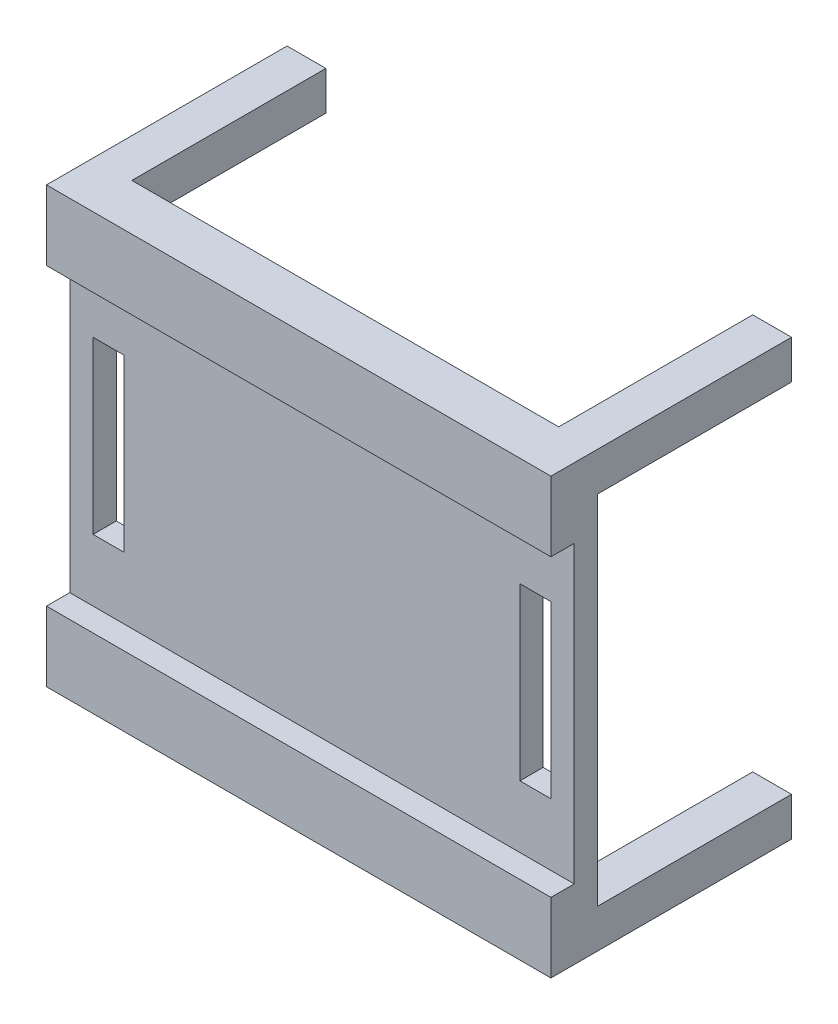
ISO-10303-21;
HEADER;
FILE_DESCRIPTION(('STEP AP214'),'2;1');
FILE_NAME('part.step','',(''),(''),'','','');
FILE_SCHEMA(('AUTOMOTIVE_DESIGN { 1 0 10303 214 1 1 1 1 }'));
ENDSEC;
DATA;
#1=APPLICATION_CONTEXT('core data for automotive mechanical design processes');
#2=APPLICATION_PROTOCOL_DEFINITION('international standard','automotive_design',2000,#1);
#3=PRODUCT_CONTEXT('',#1,'mechanical');
#4=PRODUCT('Part','Part','',(#3));
#5=PRODUCT_RELATED_PRODUCT_CATEGORY('part','',(#4));
#6=PRODUCT_DEFINITION_FORMATION('','',#4);
#7=PRODUCT_DEFINITION_CONTEXT('part definition',#1,'design');
#8=PRODUCT_DEFINITION('design','',#6,#7);
#9=PRODUCT_DEFINITION_SHAPE('','',#8);
#10=(LENGTH_UNIT() NAMED_UNIT(*) SI_UNIT(.MILLI.,.METRE.));
#11=(NAMED_UNIT(*) PLANE_ANGLE_UNIT() SI_UNIT($,.RADIAN.));
#12=(NAMED_UNIT(*) SI_UNIT($,.STERADIAN.) SOLID_ANGLE_UNIT());
#13=UNCERTAINTY_MEASURE_WITH_UNIT(LENGTH_MEASURE(1.E-05),#10,'distance_accuracy_value','');
#14=(GEOMETRIC_REPRESENTATION_CONTEXT(3) GLOBAL_UNCERTAINTY_ASSIGNED_CONTEXT((#13)) GLOBAL_UNIT_ASSIGNED_CONTEXT((#10,
#11,#12)) REPRESENTATION_CONTEXT('',''));
#15=CARTESIAN_POINT('',(0.,0.,0.));
#16=DIRECTION('',(0.,0.,1.));
#17=DIRECTION('',(1.,0.,0.));
#18=AXIS2_PLACEMENT_3D('',#15,#16,#17);
#19=CARTESIAN_POINT('',(0.,0.,0.));
#20=DIRECTION('',(0.,0.,1.));
#21=DIRECTION('',(1.,0.,0.));
#22=AXIS2_PLACEMENT_3D('',#19,#20,#21);
#23=PLANE('',#22);
#24=DIRECTION('',(-1.,0.,0.));
#25=VECTOR('',#24,1.);
#26=CARTESIAN_POINT('',(-25.5,-11.,0.));
#27=LINE('',#26,#25);
#28=CARTESIAN_POINT('',(-25.5,-11.,0.));
#29=VERTEX_POINT('',#28);
#30=CARTESIAN_POINT('',(-29.5,-11.,0.));
#31=VERTEX_POINT('',#30);
#32=EDGE_CURVE('E317',#29,#31,#27,.T.);
#33=ORIENTED_EDGE('',*,*,#32,.F.);
#34=DIRECTION('',(0.,-1.,0.));
#35=VECTOR('',#34,1.);
#36=CARTESIAN_POINT('',(-25.5,-11.,0.));
#37=LINE('',#36,#35);
#38=CARTESIAN_POINT('',(-25.5,11.,0.));
#39=VERTEX_POINT('',#38);
#40=EDGE_CURVE('E293',#39,#29,#37,.T.);
#41=ORIENTED_EDGE('',*,*,#40,.F.);
#42=DIRECTION('',(1.,0.,0.));
#43=VECTOR('',#42,1.);
#44=CARTESIAN_POINT('',(-25.5,11.,0.));
#45=LINE('',#44,#43);
#46=CARTESIAN_POINT('',(-29.5,11.,0.));
#47=VERTEX_POINT('',#46);
#48=EDGE_CURVE('E323',#47,#39,#45,.T.);
#49=ORIENTED_EDGE('',*,*,#48,.F.);
#50=DIRECTION('',(0.,1.,0.));
#51=VECTOR('',#50,1.);
#52=CARTESIAN_POINT('',(-29.5,-11.,0.));
#53=LINE('',#52,#51);
#54=EDGE_CURVE('E320',#31,#47,#53,.T.);
#55=ORIENTED_EDGE('',*,*,#54,.F.);
#56=EDGE_LOOP('',(#33,#41,#49,#55));
#57=FACE_BOUND('',#56,.T.);
#58=DIRECTION('',(-1.,0.,0.));
#59=VECTOR('',#58,1.);
#60=CARTESIAN_POINT('',(25.5,-11.,0.));
#61=LINE('',#60,#59);
#62=CARTESIAN_POINT('',(29.5,-11.,0.));
#63=VERTEX_POINT('',#62);
#64=CARTESIAN_POINT('',(25.5,-11.,0.));
#65=VERTEX_POINT('',#64);
#66=EDGE_CURVE('E296',#63,#65,#61,.T.);
#67=ORIENTED_EDGE('',*,*,#66,.F.);
#68=DIRECTION('',(0.,-1.,0.));
#69=VECTOR('',#68,1.);
#70=CARTESIAN_POINT('',(29.5,-11.,0.));
#71=LINE('',#70,#69);
#72=CARTESIAN_POINT('',(29.5,11.,0.));
#73=VERTEX_POINT('',#72);
#74=EDGE_CURVE('E294',#73,#63,#71,.T.);
#75=ORIENTED_EDGE('',*,*,#74,.F.);
#76=DIRECTION('',(1.,0.,0.));
#77=VECTOR('',#76,1.);
#78=CARTESIAN_POINT('',(25.5,11.,0.));
#79=LINE('',#78,#77);
#80=CARTESIAN_POINT('',(25.5,11.,0.));
#81=VERTEX_POINT('',#80);
#82=EDGE_CURVE('E303',#81,#73,#79,.T.);
#83=ORIENTED_EDGE('',*,*,#82,.F.);
#84=DIRECTION('',(0.,1.,0.));
#85=VECTOR('',#84,1.);
#86=CARTESIAN_POINT('',(25.5,-11.,0.));
#87=LINE('',#86,#85);
#88=EDGE_CURVE('E300',#65,#81,#87,.T.);
#89=ORIENTED_EDGE('',*,*,#88,.F.);
#90=EDGE_LOOP('',(#67,#75,#83,#89));
#91=FACE_BOUND('',#90,.T.);
#92=DIRECTION('',(1.,0.,0.));
#93=VECTOR('',#92,1.);
#94=CARTESIAN_POINT('',(-32.5,-23.,0.));
#95=LINE('',#94,#93);
#96=CARTESIAN_POINT('',(-32.5,-23.,0.));
#97=VERTEX_POINT('',#96);
#98=CARTESIAN_POINT('',(-27.5,-23.,0.));
#99=VERTEX_POINT('',#98);
#100=EDGE_CURVE('E54',#97,#99,#95,.T.);
#101=ORIENTED_EDGE('',*,*,#100,.F.);
#102=DIRECTION('',(0.,1.,0.));
#103=VECTOR('',#102,1.);
#104=CARTESIAN_POINT('',(-32.5,0.,0.));
#105=LINE('',#104,#103);
#106=CARTESIAN_POINT('',(-32.5,23.,0.));
#107=VERTEX_POINT('',#106);
#108=EDGE_CURVE('E238',#97,#107,#105,.T.);
#109=ORIENTED_EDGE('',*,*,#108,.T.);
#110=DIRECTION('',(1.,0.,0.));
#111=VECTOR('',#110,1.);
#112=CARTESIAN_POINT('',(-32.5,23.,0.));
#113=LINE('',#112,#111);
#114=CARTESIAN_POINT('',(-27.5,23.,0.));
#115=VERTEX_POINT('',#114);
#116=EDGE_CURVE('E274',#107,#115,#113,.T.);
#117=ORIENTED_EDGE('',*,*,#116,.T.);
#118=DIRECTION('',(0.,1.,0.));
#119=VECTOR('',#118,1.);
#120=CARTESIAN_POINT('',(-27.5,28.,0.));
#121=LINE('',#120,#119);
#122=CARTESIAN_POINT('',(-27.5,28.,0.));
#123=VERTEX_POINT('',#122);
#124=EDGE_CURVE('E269',#115,#123,#121,.T.);
#125=ORIENTED_EDGE('',*,*,#124,.T.);
#126=DIRECTION('',(-1.,0.,0.));
#127=VECTOR('',#126,1.);
#128=CARTESIAN_POINT('',(0.,28.,0.));
#129=LINE('',#128,#127);
#130=CARTESIAN_POINT('',(27.5,28.,0.));
#131=VERTEX_POINT('',#130);
#132=EDGE_CURVE('E408',#131,#123,#129,.T.);
#133=ORIENTED_EDGE('',*,*,#132,.F.);
#134=DIRECTION('',(0.,1.,0.));
#135=VECTOR('',#134,1.);
#136=CARTESIAN_POINT('',(27.5,28.,0.));
#137=LINE('',#136,#135);
#138=CARTESIAN_POINT('',(27.5,23.,0.));
#139=VERTEX_POINT('',#138);
#140=EDGE_CURVE('E344',#139,#131,#137,.T.);
#141=ORIENTED_EDGE('',*,*,#140,.F.);
#142=DIRECTION('',(-1.,0.,0.));
#143=VECTOR('',#142,1.);
#144=CARTESIAN_POINT('',(32.5,23.,0.));
#145=LINE('',#144,#143);
#146=CARTESIAN_POINT('',(32.5,23.,0.));
#147=VERTEX_POINT('',#146);
#148=EDGE_CURVE('E337',#147,#139,#145,.T.);
#149=ORIENTED_EDGE('',*,*,#148,.F.);
#150=DIRECTION('',(0.,1.,0.));
#151=VECTOR('',#150,1.);
#152=CARTESIAN_POINT('',(32.5,0.,0.));
#153=LINE('',#152,#151);
#154=CARTESIAN_POINT('',(32.5,-23.,0.));
#155=VERTEX_POINT('',#154);
#156=EDGE_CURVE('E406',#155,#147,#153,.T.);
#157=ORIENTED_EDGE('',*,*,#156,.F.);
#158=DIRECTION('',(-1.,0.,0.));
#159=VECTOR('',#158,1.);
#160=CARTESIAN_POINT('',(32.5,-23.,0.));
#161=LINE('',#160,#159);
#162=CARTESIAN_POINT('',(27.5,-23.,0.));
#163=VERTEX_POINT('',#162);
#164=EDGE_CURVE('E242',#155,#163,#161,.T.);
#165=ORIENTED_EDGE('',*,*,#164,.T.);
#166=DIRECTION('',(0.,-1.,0.));
#167=VECTOR('',#166,1.);
#168=CARTESIAN_POINT('',(27.5,-28.,0.));
#169=LINE('',#168,#167);
#170=CARTESIAN_POINT('',(27.5,-28.,0.));
#171=VERTEX_POINT('',#170);
#172=EDGE_CURVE('E239',#163,#171,#169,.T.);
#173=ORIENTED_EDGE('',*,*,#172,.T.);
#174=DIRECTION('',(-1.,0.,0.));
#175=VECTOR('',#174,1.);
#176=CARTESIAN_POINT('',(0.,-28.,0.));
#177=LINE('',#176,#175);
#178=CARTESIAN_POINT('',(-27.5,-28.,0.));
#179=VERTEX_POINT('',#178);
#180=EDGE_CURVE('E404',#171,#179,#177,.T.);
#181=ORIENTED_EDGE('',*,*,#180,.T.);
#182=DIRECTION('',(0.,-1.,0.));
#183=VECTOR('',#182,1.);
#184=CARTESIAN_POINT('',(-27.5,-28.,0.));
#185=LINE('',#184,#183);
#186=EDGE_CURVE('E50',#99,#179,#185,.T.);
#187=ORIENTED_EDGE('',*,*,#186,.F.);
#188=EDGE_LOOP('',(#101,#109,#117,#125,#133,#141,#149,#157,#165,#173,#181,#187));
#189=FACE_BOUND('',#188,.T.);
#190=ADVANCED_FACE('F35',(#57,#91,#189),#23,.F.);
#191=CARTESIAN_POINT('',(0.,0.,6.));
#192=DIRECTION('',(0.,0.,1.));
#193=DIRECTION('',(1.,0.,0.));
#194=AXIS2_PLACEMENT_3D('',#191,#192,#193);
#195=PLANE('',#194);
#196=DIRECTION('',(-1.,0.,0.));
#197=VECTOR('',#196,1.);
#198=CARTESIAN_POINT('',(32.5,19.,6.));
#199=LINE('',#198,#197);
#200=CARTESIAN_POINT('',(32.5,19.,6.));
#201=VERTEX_POINT('',#200);
#202=CARTESIAN_POINT('',(-32.5,19.,6.));
#203=VERTEX_POINT('',#202);
#204=EDGE_CURVE('E369',#201,#203,#199,.T.);
#205=ORIENTED_EDGE('',*,*,#204,.F.);
#206=DIRECTION('',(0.,1.,0.));
#207=VECTOR('',#206,1.);
#208=CARTESIAN_POINT('',(32.5,0.,6.));
#209=LINE('',#208,#207);
#210=CARTESIAN_POINT('',(32.5,28.,6.));
#211=VERTEX_POINT('',#210);
#212=EDGE_CURVE('E395',#201,#211,#209,.T.);
#213=ORIENTED_EDGE('',*,*,#212,.T.);
#214=DIRECTION('',(-1.,0.,0.));
#215=VECTOR('',#214,1.);
#216=CARTESIAN_POINT('',(0.,28.,6.));
#217=LINE('',#216,#215);
#218=CARTESIAN_POINT('',(-32.5,28.,6.));
#219=VERTEX_POINT('',#218);
#220=EDGE_CURVE('E399',#211,#219,#217,.T.);
#221=ORIENTED_EDGE('',*,*,#220,.T.);
#222=DIRECTION('',(0.,1.,0.));
#223=VECTOR('',#222,1.);
#224=CARTESIAN_POINT('',(-32.5,0.,6.));
#225=LINE('',#224,#223);
#226=EDGE_CURVE('E392',#203,#219,#225,.T.);
#227=ORIENTED_EDGE('',*,*,#226,.F.);
#228=EDGE_LOOP('',(#205,#213,#221,#227));
#229=FACE_BOUND('',#228,.T.);
#230=ADVANCED_FACE('F455',(#229),#195,.T.);
#231=CARTESIAN_POINT('',(-32.5,0.,6.));
#232=DIRECTION('',(-1.,0.,0.));
#233=DIRECTION('',(0.,0.,1.));
#234=AXIS2_PLACEMENT_3D('',#231,#232,#233);
#235=PLANE('',#234);
#236=DIRECTION('',(0.,0.,1.));
#237=VECTOR('',#236,1.);
#238=CARTESIAN_POINT('',(-32.5,19.,3.));
#239=LINE('',#238,#237);
#240=CARTESIAN_POINT('',(-32.5,19.,3.));
#241=VERTEX_POINT('',#240);
#242=EDGE_CURVE('E380',#241,#203,#239,.T.);
#243=ORIENTED_EDGE('',*,*,#242,.T.);
#244=ORIENTED_EDGE('',*,*,#226,.T.);
#245=DIRECTION('',(0.,0.,-1.));
#246=VECTOR('',#245,1.);
#247=CARTESIAN_POINT('',(-32.5,28.,6.));
#248=LINE('',#247,#246);
#249=CARTESIAN_POINT('',(-32.5,28.,-25.));
#250=VERTEX_POINT('',#249);
#251=EDGE_CURVE('E402',#219,#250,#248,.T.);
#252=ORIENTED_EDGE('',*,*,#251,.T.);
#253=DIRECTION('',(0.,-1.,0.));
#254=VECTOR('',#253,1.);
#255=CARTESIAN_POINT('',(-32.5,28.,-25.));
#256=LINE('',#255,#254);
#257=CARTESIAN_POINT('',(-32.5,23.,-25.));
#258=VERTEX_POINT('',#257);
#259=EDGE_CURVE('E270',#250,#258,#256,.T.);
#260=ORIENTED_EDGE('',*,*,#259,.T.);
#261=DIRECTION('',(0.,0.,1.));
#262=VECTOR('',#261,1.);
#263=CARTESIAN_POINT('',(-32.5,23.,-25.));
#264=LINE('',#263,#262);
#265=EDGE_CURVE('E283',#258,#107,#264,.T.);
#266=ORIENTED_EDGE('',*,*,#265,.T.);
#267=ORIENTED_EDGE('',*,*,#108,.F.);
#268=DIRECTION('',(0.,0.,1.));
#269=VECTOR('',#268,1.);
#270=CARTESIAN_POINT('',(-32.5,-23.,-25.));
#271=LINE('',#270,#269);
#272=CARTESIAN_POINT('',(-32.5,-23.,-25.));
#273=VERTEX_POINT('',#272);
#274=EDGE_CURVE('E221',#273,#97,#271,.T.);
#275=ORIENTED_EDGE('',*,*,#274,.F.);
#276=DIRECTION('',(0.,1.,0.));
#277=VECTOR('',#276,1.);
#278=CARTESIAN_POINT('',(-32.5,-28.,-25.));
#279=LINE('',#278,#277);
#280=CARTESIAN_POINT('',(-32.5,-28.,-25.));
#281=VERTEX_POINT('',#280);
#282=EDGE_CURVE('E227',#281,#273,#279,.T.);
#283=ORIENTED_EDGE('',*,*,#282,.F.);
#284=DIRECTION('',(0.,0.,-1.));
#285=VECTOR('',#284,1.);
#286=CARTESIAN_POINT('',(-32.5,-28.,6.));
#287=LINE('',#286,#285);
#288=CARTESIAN_POINT('',(-32.5,-28.,6.));
#289=VERTEX_POINT('',#288);
#290=EDGE_CURVE('E416',#289,#281,#287,.T.);
#291=ORIENTED_EDGE('',*,*,#290,.F.);
#292=CARTESIAN_POINT('',(-32.5,-19.,6.));
#293=VERTEX_POINT('',#292);
#294=EDGE_CURVE('E388',#289,#293,#225,.T.);
#295=ORIENTED_EDGE('',*,*,#294,.T.);
#296=DIRECTION('',(0.,0.,1.));
#297=VECTOR('',#296,1.);
#298=CARTESIAN_POINT('',(-32.5,-19.,3.));
#299=LINE('',#298,#297);
#300=CARTESIAN_POINT('',(-32.5,-19.,3.));
#301=VERTEX_POINT('',#300);
#302=EDGE_CURVE('E377',#301,#293,#299,.T.);
#303=ORIENTED_EDGE('',*,*,#302,.F.);
#304=DIRECTION('',(0.,-1.,0.));
#305=VECTOR('',#304,1.);
#306=CARTESIAN_POINT('',(-32.5,-19.,3.));
#307=LINE('',#306,#305);
#308=EDGE_CURVE('E365',#241,#301,#307,.T.);
#309=ORIENTED_EDGE('',*,*,#308,.F.);
#310=EDGE_LOOP('',(#243,#244,#252,#260,#266,#267,#275,#283,#291,#295,#303,#309));
#311=FACE_BOUND('',#310,.T.);
#312=ADVANCED_FACE('F37',(#311),#235,.T.);
#313=CARTESIAN_POINT('',(0.,-28.,6.));
#314=DIRECTION('',(0.,-1.,0.));
#315=DIRECTION('',(1.,0.,0.));
#316=AXIS2_PLACEMENT_3D('',#313,#314,#315);
#317=PLANE('',#316);
#318=ORIENTED_EDGE('',*,*,#180,.F.);
#319=DIRECTION('',(0.,0.,1.));
#320=VECTOR('',#319,1.);
#321=CARTESIAN_POINT('',(27.5,-28.,-25.));
#322=LINE('',#321,#320);
#323=CARTESIAN_POINT('',(27.5,-28.,-25.));
#324=VERTEX_POINT('',#323);
#325=EDGE_CURVE('E267',#324,#171,#322,.T.);
#326=ORIENTED_EDGE('',*,*,#325,.F.);
#327=DIRECTION('',(1.,0.,0.));
#328=VECTOR('',#327,1.);
#329=CARTESIAN_POINT('',(32.5,-28.,-25.));
#330=LINE('',#329,#328);
#331=CARTESIAN_POINT('',(32.5,-28.,-25.));
#332=VERTEX_POINT('',#331);
#333=EDGE_CURVE('E251',#324,#332,#330,.T.);
#334=ORIENTED_EDGE('',*,*,#333,.T.);
#335=DIRECTION('',(0.,0.,-1.));
#336=VECTOR('',#335,1.);
#337=CARTESIAN_POINT('',(32.5,-28.,6.));
#338=LINE('',#337,#336);
#339=CARTESIAN_POINT('',(32.5,-28.,6.));
#340=VERTEX_POINT('',#339);
#341=EDGE_CURVE('E414',#340,#332,#338,.T.);
#342=ORIENTED_EDGE('',*,*,#341,.F.);
#343=DIRECTION('',(-1.,0.,0.));
#344=VECTOR('',#343,1.);
#345=CARTESIAN_POINT('',(0.,-28.,6.));
#346=LINE('',#345,#344);
#347=EDGE_CURVE('E391',#340,#289,#346,.T.);
#348=ORIENTED_EDGE('',*,*,#347,.T.);
#349=ORIENTED_EDGE('',*,*,#290,.T.);
#350=DIRECTION('',(-1.,0.,0.));
#351=VECTOR('',#350,1.);
#352=CARTESIAN_POINT('',(-32.5,-28.,-25.));
#353=LINE('',#352,#351);
#354=CARTESIAN_POINT('',(-27.5,-28.,-25.));
#355=VERTEX_POINT('',#354);
#356=EDGE_CURVE('E233',#355,#281,#353,.T.);
#357=ORIENTED_EDGE('',*,*,#356,.F.);
#358=DIRECTION('',(0.,0.,1.));
#359=VECTOR('',#358,1.);
#360=CARTESIAN_POINT('',(-27.5,-28.,-25.));
#361=LINE('',#360,#359);
#362=EDGE_CURVE('E244',#355,#179,#361,.T.);
#363=ORIENTED_EDGE('',*,*,#362,.T.);
#364=EDGE_LOOP('',(#318,#326,#334,#342,#348,#349,#357,#363));
#365=FACE_BOUND('',#364,.T.);
#366=ADVANCED_FACE('F473',(#365),#317,.T.);
#367=CARTESIAN_POINT('',(32.5,0.,6.));
#368=DIRECTION('',(-1.,0.,0.));
#369=DIRECTION('',(0.,0.,1.));
#370=AXIS2_PLACEMENT_3D('',#367,#368,#369);
#371=PLANE('',#370);
#372=ORIENTED_EDGE('',*,*,#212,.F.);
#373=DIRECTION('',(0.,0.,1.));
#374=VECTOR('',#373,1.);
#375=CARTESIAN_POINT('',(32.5,19.,3.));
#376=LINE('',#375,#374);
#377=CARTESIAN_POINT('',(32.5,19.,3.));
#378=VERTEX_POINT('',#377);
#379=EDGE_CURVE('E382',#378,#201,#376,.T.);
#380=ORIENTED_EDGE('',*,*,#379,.F.);
#381=DIRECTION('',(0.,1.,0.));
#382=VECTOR('',#381,1.);
#383=CARTESIAN_POINT('',(32.5,-19.,3.));
#384=LINE('',#383,#382);
#385=CARTESIAN_POINT('',(32.5,-19.,3.));
#386=VERTEX_POINT('',#385);
#387=EDGE_CURVE('E372',#386,#378,#384,.T.);
#388=ORIENTED_EDGE('',*,*,#387,.F.);
#389=DIRECTION('',(0.,0.,1.));
#390=VECTOR('',#389,1.);
#391=CARTESIAN_POINT('',(32.5,-19.,3.));
#392=LINE('',#391,#390);
#393=CARTESIAN_POINT('',(32.5,-19.,6.));
#394=VERTEX_POINT('',#393);
#395=EDGE_CURVE('E384',#386,#394,#392,.T.);
#396=ORIENTED_EDGE('',*,*,#395,.T.);
#397=EDGE_CURVE('E396',#340,#394,#209,.T.);
#398=ORIENTED_EDGE('',*,*,#397,.F.);
#399=ORIENTED_EDGE('',*,*,#341,.T.);
#400=DIRECTION('',(0.,1.,0.));
#401=VECTOR('',#400,1.);
#402=CARTESIAN_POINT('',(32.5,-28.,-25.));
#403=LINE('',#402,#401);
#404=CARTESIAN_POINT('',(32.5,-23.,-25.));
#405=VERTEX_POINT('',#404);
#406=EDGE_CURVE('E248',#332,#405,#403,.T.);
#407=ORIENTED_EDGE('',*,*,#406,.T.);
#408=DIRECTION('',(0.,0.,1.));
#409=VECTOR('',#408,1.);
#410=CARTESIAN_POINT('',(32.5,-23.,-25.));
#411=LINE('',#410,#409);
#412=EDGE_CURVE('E259',#405,#155,#411,.T.);
#413=ORIENTED_EDGE('',*,*,#412,.T.);
#414=ORIENTED_EDGE('',*,*,#156,.T.);
#415=DIRECTION('',(0.,0.,1.));
#416=VECTOR('',#415,1.);
#417=CARTESIAN_POINT('',(32.5,23.,-25.));
#418=LINE('',#417,#416);
#419=CARTESIAN_POINT('',(32.5,23.,-25.));
#420=VERTEX_POINT('',#419);
#421=EDGE_CURVE('E361',#420,#147,#418,.T.);
#422=ORIENTED_EDGE('',*,*,#421,.F.);
#423=DIRECTION('',(0.,-1.,0.));
#424=VECTOR('',#423,1.);
#425=CARTESIAN_POINT('',(32.5,28.,-25.));
#426=LINE('',#425,#424);
#427=CARTESIAN_POINT('',(32.5,28.,-25.));
#428=VERTEX_POINT('',#427);
#429=EDGE_CURVE('E340',#428,#420,#426,.T.);
#430=ORIENTED_EDGE('',*,*,#429,.F.);
#431=DIRECTION('',(0.,0.,-1.));
#432=VECTOR('',#431,1.);
#433=CARTESIAN_POINT('',(32.5,28.,6.));
#434=LINE('',#433,#432);
#435=EDGE_CURVE('E412',#211,#428,#434,.T.);
#436=ORIENTED_EDGE('',*,*,#435,.F.);
#437=EDGE_LOOP('',(#372,#380,#388,#396,#398,#399,#407,#413,#414,#422,#430,#436));
#438=FACE_BOUND('',#437,.T.);
#439=ADVANCED_FACE('F470',(#438),#371,.F.);
#440=CARTESIAN_POINT('',(0.,28.,6.));
#441=DIRECTION('',(0.,-1.,0.));
#442=DIRECTION('',(1.,0.,0.));
#443=AXIS2_PLACEMENT_3D('',#440,#441,#442);
#444=PLANE('',#443);
#445=ORIENTED_EDGE('',*,*,#435,.T.);
#446=DIRECTION('',(1.,0.,0.));
#447=VECTOR('',#446,1.);
#448=CARTESIAN_POINT('',(32.5,28.,-25.));
#449=LINE('',#448,#447);
#450=CARTESIAN_POINT('',(27.5,28.,-25.));
#451=VERTEX_POINT('',#450);
#452=EDGE_CURVE('E348',#451,#428,#449,.T.);
#453=ORIENTED_EDGE('',*,*,#452,.F.);
#454=DIRECTION('',(0.,0.,1.));
#455=VECTOR('',#454,1.);
#456=CARTESIAN_POINT('',(27.5,28.,-25.));
#457=LINE('',#456,#455);
#458=EDGE_CURVE('E351',#451,#131,#457,.T.);
#459=ORIENTED_EDGE('',*,*,#458,.T.);
#460=ORIENTED_EDGE('',*,*,#132,.T.);
#461=DIRECTION('',(0.,0.,1.));
#462=VECTOR('',#461,1.);
#463=CARTESIAN_POINT('',(-27.5,28.,-25.));
#464=LINE('',#463,#462);
#465=CARTESIAN_POINT('',(-27.5,28.,-25.));
#466=VERTEX_POINT('',#465);
#467=EDGE_CURVE('E291',#466,#123,#464,.T.);
#468=ORIENTED_EDGE('',*,*,#467,.F.);
#469=DIRECTION('',(-1.,0.,0.));
#470=VECTOR('',#469,1.);
#471=CARTESIAN_POINT('',(-32.5,28.,-25.));
#472=LINE('',#471,#470);
#473=EDGE_CURVE('E273',#466,#250,#472,.T.);
#474=ORIENTED_EDGE('',*,*,#473,.T.);
#475=ORIENTED_EDGE('',*,*,#251,.F.);
#476=ORIENTED_EDGE('',*,*,#220,.F.);
#477=EDGE_LOOP('',(#445,#453,#459,#460,#468,#474,#475,#476));
#478=FACE_BOUND('',#477,.T.);
#479=ADVANCED_FACE('F467',(#478),#444,.F.);
#480=DIRECTION('',(1.,0.,0.));
#481=VECTOR('',#480,1.);
#482=CARTESIAN_POINT('',(32.5,-19.,6.));
#483=LINE('',#482,#481);
#484=EDGE_CURVE('E364',#293,#394,#483,.T.);
#485=ORIENTED_EDGE('',*,*,#484,.F.);
#486=ORIENTED_EDGE('',*,*,#294,.F.);
#487=ORIENTED_EDGE('',*,*,#347,.F.);
#488=ORIENTED_EDGE('',*,*,#397,.T.);
#489=EDGE_LOOP('',(#485,#486,#487,#488));
#490=FACE_BOUND('',#489,.T.);
#491=ADVANCED_FACE('F463',(#490),#195,.T.);
#492=CARTESIAN_POINT('',(32.5,19.,3.));
#493=DIRECTION('',(0.,1.,0.));
#494=DIRECTION('',(0.,0.,1.));
#495=AXIS2_PLACEMENT_3D('',#492,#493,#494);
#496=PLANE('',#495);
#497=ORIENTED_EDGE('',*,*,#204,.T.);
#498=ORIENTED_EDGE('',*,*,#242,.F.);
#499=DIRECTION('',(-1.,0.,0.));
#500=VECTOR('',#499,1.);
#501=CARTESIAN_POINT('',(32.5,19.,3.));
#502=LINE('',#501,#500);
#503=EDGE_CURVE('E374',#378,#241,#502,.T.);
#504=ORIENTED_EDGE('',*,*,#503,.F.);
#505=ORIENTED_EDGE('',*,*,#379,.T.);
#506=EDGE_LOOP('',(#497,#498,#504,#505));
#507=FACE_BOUND('',#506,.T.);
#508=ADVANCED_FACE('F606',(#507),#496,.F.);
#509=CARTESIAN_POINT('',(32.5,-19.,3.));
#510=DIRECTION('',(0.,-1.,0.));
#511=DIRECTION('',(0.,0.,-1.));
#512=AXIS2_PLACEMENT_3D('',#509,#510,#511);
#513=PLANE('',#512);
#514=ORIENTED_EDGE('',*,*,#484,.T.);
#515=ORIENTED_EDGE('',*,*,#395,.F.);
#516=DIRECTION('',(1.,0.,0.));
#517=VECTOR('',#516,1.);
#518=CARTESIAN_POINT('',(32.5,-19.,3.));
#519=LINE('',#518,#517);
#520=EDGE_CURVE('E368',#301,#386,#519,.T.);
#521=ORIENTED_EDGE('',*,*,#520,.F.);
#522=ORIENTED_EDGE('',*,*,#302,.T.);
#523=EDGE_LOOP('',(#514,#515,#521,#522));
#524=FACE_BOUND('',#523,.T.);
#525=ADVANCED_FACE('F605',(#524),#513,.F.);
#526=CARTESIAN_POINT('',(0.,0.,3.));
#527=DIRECTION('',(0.,0.,1.));
#528=DIRECTION('',(1.,0.,0.));
#529=AXIS2_PLACEMENT_3D('',#526,#527,#528);
#530=PLANE('',#529);
#531=DIRECTION('',(0.,1.,0.));
#532=VECTOR('',#531,1.);
#533=CARTESIAN_POINT('',(29.5,0.,3.));
#534=LINE('',#533,#532);
#535=CARTESIAN_POINT('',(29.5,-11.,3.));
#536=VERTEX_POINT('',#535);
#537=CARTESIAN_POINT('',(29.5,11.,3.));
#538=VERTEX_POINT('',#537);
#539=EDGE_CURVE('E11',#536,#538,#534,.T.);
#540=ORIENTED_EDGE('',*,*,#539,.F.);
#541=DIRECTION('',(1.,0.,0.));
#542=VECTOR('',#541,1.);
#543=CARTESIAN_POINT('',(0.,-11.,3.));
#544=LINE('',#543,#542);
#545=CARTESIAN_POINT('',(25.5,-11.,3.));
#546=VERTEX_POINT('',#545);
#547=EDGE_CURVE('E427',#546,#536,#544,.T.);
#548=ORIENTED_EDGE('',*,*,#547,.F.);
#549=DIRECTION('',(0.,-1.,0.));
#550=VECTOR('',#549,1.);
#551=CARTESIAN_POINT('',(25.5,0.,3.));
#552=LINE('',#551,#550);
#553=CARTESIAN_POINT('',(25.5,11.,3.));
#554=VERTEX_POINT('',#553);
#555=EDGE_CURVE('E429',#554,#546,#552,.T.);
#556=ORIENTED_EDGE('',*,*,#555,.F.);
#557=DIRECTION('',(-1.,0.,0.));
#558=VECTOR('',#557,1.);
#559=CARTESIAN_POINT('',(0.,11.,3.));
#560=LINE('',#559,#558);
#561=EDGE_CURVE('E43',#538,#554,#560,.T.);
#562=ORIENTED_EDGE('',*,*,#561,.F.);
#563=EDGE_LOOP('',(#540,#548,#556,#562));
#564=FACE_BOUND('',#563,.T.);
#565=DIRECTION('',(0.,1.,0.));
#566=VECTOR('',#565,1.);
#567=CARTESIAN_POINT('',(-25.5,0.,3.));
#568=LINE('',#567,#566);
#569=CARTESIAN_POINT('',(-25.5,-11.,3.));
#570=VERTEX_POINT('',#569);
#571=CARTESIAN_POINT('',(-25.5,11.,3.));
#572=VERTEX_POINT('',#571);
#573=EDGE_CURVE('E425',#570,#572,#568,.T.);
#574=ORIENTED_EDGE('',*,*,#573,.F.);
#575=DIRECTION('',(1.,0.,0.));
#576=VECTOR('',#575,1.);
#577=CARTESIAN_POINT('',(0.,-11.,3.));
#578=LINE('',#577,#576);
#579=CARTESIAN_POINT('',(-29.5,-11.,3.));
#580=VERTEX_POINT('',#579);
#581=EDGE_CURVE('E418',#580,#570,#578,.T.);
#582=ORIENTED_EDGE('',*,*,#581,.F.);
#583=DIRECTION('',(0.,-1.,0.));
#584=VECTOR('',#583,1.);
#585=CARTESIAN_POINT('',(-29.5,0.,3.));
#586=LINE('',#585,#584);
#587=CARTESIAN_POINT('',(-29.5,11.,3.));
#588=VERTEX_POINT('',#587);
#589=EDGE_CURVE('E420',#588,#580,#586,.T.);
#590=ORIENTED_EDGE('',*,*,#589,.F.);
#591=DIRECTION('',(-1.,0.,0.));
#592=VECTOR('',#591,1.);
#593=CARTESIAN_POINT('',(0.,11.,3.));
#594=LINE('',#593,#592);
#595=EDGE_CURVE('E423',#572,#588,#594,.T.);
#596=ORIENTED_EDGE('',*,*,#595,.F.);
#597=EDGE_LOOP('',(#574,#582,#590,#596));
#598=FACE_BOUND('',#597,.T.);
#599=ORIENTED_EDGE('',*,*,#308,.T.);
#600=ORIENTED_EDGE('',*,*,#520,.T.);
#601=ORIENTED_EDGE('',*,*,#387,.T.);
#602=ORIENTED_EDGE('',*,*,#503,.T.);
#603=EDGE_LOOP('',(#599,#600,#601,#602));
#604=FACE_BOUND('',#603,.T.);
#605=ADVANCED_FACE('F444',(#564,#598,#604),#530,.T.);
#606=CARTESIAN_POINT('',(32.5,23.,-25.));
#607=DIRECTION('',(0.,1.,0.));
#608=DIRECTION('',(0.,0.,1.));
#609=AXIS2_PLACEMENT_3D('',#606,#607,#608);
#610=PLANE('',#609);
#611=ORIENTED_EDGE('',*,*,#148,.T.);
#612=DIRECTION('',(0.,0.,1.));
#613=VECTOR('',#612,1.);
#614=CARTESIAN_POINT('',(27.5,23.,-25.));
#615=LINE('',#614,#613);
#616=CARTESIAN_POINT('',(27.5,23.,-25.));
#617=VERTEX_POINT('',#616);
#618=EDGE_CURVE('E358',#617,#139,#615,.T.);
#619=ORIENTED_EDGE('',*,*,#618,.F.);
#620=DIRECTION('',(-1.,0.,0.));
#621=VECTOR('',#620,1.);
#622=CARTESIAN_POINT('',(32.5,23.,-25.));
#623=LINE('',#622,#621);
#624=EDGE_CURVE('E343',#420,#617,#623,.T.);
#625=ORIENTED_EDGE('',*,*,#624,.F.);
#626=ORIENTED_EDGE('',*,*,#421,.T.);
#627=EDGE_LOOP('',(#611,#619,#625,#626));
#628=FACE_BOUND('',#627,.T.);
#629=ADVANCED_FACE('F598',(#628),#610,.F.);
#630=CARTESIAN_POINT('',(27.5,28.,-25.));
#631=DIRECTION('',(1.,0.,0.));
#632=DIRECTION('',(0.,0.,-1.));
#633=AXIS2_PLACEMENT_3D('',#630,#631,#632);
#634=PLANE('',#633);
#635=ORIENTED_EDGE('',*,*,#140,.T.);
#636=ORIENTED_EDGE('',*,*,#458,.F.);
#637=DIRECTION('',(0.,1.,0.));
#638=VECTOR('',#637,1.);
#639=CARTESIAN_POINT('',(27.5,28.,-25.));
#640=LINE('',#639,#638);
#641=EDGE_CURVE('E346',#617,#451,#640,.T.);
#642=ORIENTED_EDGE('',*,*,#641,.F.);
#643=ORIENTED_EDGE('',*,*,#618,.T.);
#644=EDGE_LOOP('',(#635,#636,#642,#643));
#645=FACE_BOUND('',#644,.T.);
#646=ADVANCED_FACE('F594',(#645),#634,.F.);
#647=CARTESIAN_POINT('',(0.,0.,-25.));
#648=DIRECTION('',(0.,0.,-1.));
#649=DIRECTION('',(-1.,0.,0.));
#650=AXIS2_PLACEMENT_3D('',#647,#648,#649);
#651=PLANE('',#650);
#652=CARTESIAN_POINT('',(29.,24.5,-25.));
#653=DIRECTION('',(0.,0.,-1.));
#654=DIRECTION('',(-1.,0.,0.));
#655=AXIS2_PLACEMENT_3D('',#652,#653,#654);
#656=CIRCLE('',#655,1.1);
#657=CARTESIAN_POINT('',(27.9,24.5,-25.));
#658=VERTEX_POINT('',#657);
#659=EDGE_CURVE('E309',#658,#658,#656,.T.);
#660=ORIENTED_EDGE('',*,*,#659,.F.);
#661=EDGE_LOOP('',(#660));
#662=FACE_BOUND('',#661,.T.);
#663=ORIENTED_EDGE('',*,*,#429,.T.);
#664=ORIENTED_EDGE('',*,*,#624,.T.);
#665=ORIENTED_EDGE('',*,*,#641,.T.);
#666=ORIENTED_EDGE('',*,*,#452,.T.);
#667=EDGE_LOOP('',(#663,#664,#665,#666));
#668=FACE_BOUND('',#667,.T.);
#669=ADVANCED_FACE('F590',(#662,#668),#651,.T.);
#670=CARTESIAN_POINT('',(29.,24.5,-22.));
#671=DIRECTION('',(0.,0.,-1.));
#672=DIRECTION('',(-1.,0.,0.));
#673=AXIS2_PLACEMENT_3D('',#670,#671,#672);
#674=CYLINDRICAL_SURFACE('',#673,1.1);
#675=CARTESIAN_POINT('',(29.,24.5,-22.));
#676=DIRECTION('',(0.,0.,-1.));
#677=DIRECTION('',(-1.,0.,0.));
#678=AXIS2_PLACEMENT_3D('',#675,#676,#677);
#679=CIRCLE('',#678,1.1);
#680=CARTESIAN_POINT('',(27.9,24.5,-22.));
#681=VERTEX_POINT('',#680);
#682=EDGE_CURVE('E334',#681,#681,#679,.T.);
#683=ORIENTED_EDGE('',*,*,#682,.F.);
#684=EDGE_LOOP('',(#683));
#685=FACE_BOUND('',#684,.T.);
#686=ORIENTED_EDGE('',*,*,#659,.T.);
#687=EDGE_LOOP('',(#686));
#688=FACE_BOUND('',#687,.T.);
#689=ADVANCED_FACE('F586',(#685,#688),#674,.F.);
#690=CARTESIAN_POINT('',(29.,24.5,-22.));
#691=DIRECTION('',(0.,0.,-1.));
#692=DIRECTION('',(-1.,0.,0.));
#693=AXIS2_PLACEMENT_3D('',#690,#691,#692);
#694=PLANE('',#693);
#695=ORIENTED_EDGE('',*,*,#682,.T.);
#696=EDGE_LOOP('',(#695));
#697=FACE_BOUND('',#696,.T.);
#698=ADVANCED_FACE('F582',(#697),#694,.T.);
#699=CARTESIAN_POINT('',(-25.5,-11.,6.));
#700=DIRECTION('',(1.,0.,0.));
#701=DIRECTION('',(0.,0.,-1.));
#702=AXIS2_PLACEMENT_3D('',#699,#700,#701);
#703=PLANE('',#702);
#704=ORIENTED_EDGE('',*,*,#573,.T.);
#705=DIRECTION('',(0.,0.,-1.));
#706=VECTOR('',#705,1.);
#707=CARTESIAN_POINT('',(-25.5,11.,6.));
#708=LINE('',#707,#706);
#709=EDGE_CURVE('E297',#572,#39,#708,.T.);
#710=ORIENTED_EDGE('',*,*,#709,.T.);
#711=ORIENTED_EDGE('',*,*,#40,.T.);
#712=DIRECTION('',(0.,0.,-1.));
#713=VECTOR('',#712,1.);
#714=CARTESIAN_POINT('',(-25.5,-11.,6.));
#715=LINE('',#714,#713);
#716=EDGE_CURVE('E326',#570,#29,#715,.T.);
#717=ORIENTED_EDGE('',*,*,#716,.F.);
#718=EDGE_LOOP('',(#704,#710,#711,#717));
#719=FACE_BOUND('',#718,.T.);
#720=ADVANCED_FACE('F572',(#719),#703,.F.);
#721=CARTESIAN_POINT('',(-25.5,11.,6.));
#722=DIRECTION('',(0.,1.,0.));
#723=DIRECTION('',(0.,0.,1.));
#724=AXIS2_PLACEMENT_3D('',#721,#722,#723);
#725=PLANE('',#724);
#726=ORIENTED_EDGE('',*,*,#595,.T.);
#727=DIRECTION('',(0.,0.,-1.));
#728=VECTOR('',#727,1.);
#729=CARTESIAN_POINT('',(-29.5,11.,6.));
#730=LINE('',#729,#728);
#731=EDGE_CURVE('E328',#588,#47,#730,.T.);
#732=ORIENTED_EDGE('',*,*,#731,.T.);
#733=ORIENTED_EDGE('',*,*,#48,.T.);
#734=ORIENTED_EDGE('',*,*,#709,.F.);
#735=EDGE_LOOP('',(#726,#732,#733,#734));
#736=FACE_BOUND('',#735,.T.);
#737=ADVANCED_FACE('F568',(#736),#725,.F.);
#738=CARTESIAN_POINT('',(-29.5,-11.,6.));
#739=DIRECTION('',(-1.,0.,0.));
#740=DIRECTION('',(0.,0.,1.));
#741=AXIS2_PLACEMENT_3D('',#738,#739,#740);
#742=PLANE('',#741);
#743=ORIENTED_EDGE('',*,*,#589,.T.);
#744=DIRECTION('',(0.,0.,-1.));
#745=VECTOR('',#744,1.);
#746=CARTESIAN_POINT('',(-29.5,-11.,6.));
#747=LINE('',#746,#745);
#748=EDGE_CURVE('E330',#580,#31,#747,.T.);
#749=ORIENTED_EDGE('',*,*,#748,.T.);
#750=ORIENTED_EDGE('',*,*,#54,.T.);
#751=ORIENTED_EDGE('',*,*,#731,.F.);
#752=EDGE_LOOP('',(#743,#749,#750,#751));
#753=FACE_BOUND('',#752,.T.);
#754=ADVANCED_FACE('F571',(#753),#742,.F.);
#755=CARTESIAN_POINT('',(-25.5,-11.,6.));
#756=DIRECTION('',(0.,-1.,0.));
#757=DIRECTION('',(0.,0.,-1.));
#758=AXIS2_PLACEMENT_3D('',#755,#756,#757);
#759=PLANE('',#758);
#760=ORIENTED_EDGE('',*,*,#581,.T.);
#761=ORIENTED_EDGE('',*,*,#716,.T.);
#762=ORIENTED_EDGE('',*,*,#32,.T.);
#763=ORIENTED_EDGE('',*,*,#748,.F.);
#764=EDGE_LOOP('',(#760,#761,#762,#763));
#765=FACE_BOUND('',#764,.T.);
#766=ADVANCED_FACE('F567',(#765),#759,.F.);
#767=CARTESIAN_POINT('',(29.5,-11.,6.));
#768=DIRECTION('',(1.,0.,0.));
#769=DIRECTION('',(0.,0.,-1.));
#770=AXIS2_PLACEMENT_3D('',#767,#768,#769);
#771=PLANE('',#770);
#772=ORIENTED_EDGE('',*,*,#539,.T.);
#773=DIRECTION('',(0.,0.,-1.));
#774=VECTOR('',#773,1.);
#775=CARTESIAN_POINT('',(29.5,11.,6.));
#776=LINE('',#775,#774);
#777=EDGE_CURVE('E307',#538,#73,#776,.T.);
#778=ORIENTED_EDGE('',*,*,#777,.T.);
#779=ORIENTED_EDGE('',*,*,#74,.T.);
#780=DIRECTION('',(0.,0.,-1.));
#781=VECTOR('',#780,1.);
#782=CARTESIAN_POINT('',(29.5,-11.,6.));
#783=LINE('',#782,#781);
#784=EDGE_CURVE('E306',#536,#63,#783,.T.);
#785=ORIENTED_EDGE('',*,*,#784,.F.);
#786=EDGE_LOOP('',(#772,#778,#779,#785));
#787=FACE_BOUND('',#786,.T.);
#788=ADVANCED_FACE('F451',(#787),#771,.F.);
#789=CARTESIAN_POINT('',(25.5,11.,6.));
#790=DIRECTION('',(0.,1.,0.));
#791=DIRECTION('',(0.,0.,1.));
#792=AXIS2_PLACEMENT_3D('',#789,#790,#791);
#793=PLANE('',#792);
#794=ORIENTED_EDGE('',*,*,#561,.T.);
#795=DIRECTION('',(0.,0.,-1.));
#796=VECTOR('',#795,1.);
#797=CARTESIAN_POINT('',(25.5,11.,6.));
#798=LINE('',#797,#796);
#799=EDGE_CURVE('E310',#554,#81,#798,.T.);
#800=ORIENTED_EDGE('',*,*,#799,.T.);
#801=ORIENTED_EDGE('',*,*,#82,.T.);
#802=ORIENTED_EDGE('',*,*,#777,.F.);
#803=EDGE_LOOP('',(#794,#800,#801,#802));
#804=FACE_BOUND('',#803,.T.);
#805=ADVANCED_FACE('F435',(#804),#793,.F.);
#806=CARTESIAN_POINT('',(25.5,-11.,6.));
#807=DIRECTION('',(-1.,0.,0.));
#808=DIRECTION('',(0.,0.,1.));
#809=AXIS2_PLACEMENT_3D('',#806,#807,#808);
#810=PLANE('',#809);
#811=ORIENTED_EDGE('',*,*,#555,.T.);
#812=DIRECTION('',(0.,0.,-1.));
#813=VECTOR('',#812,1.);
#814=CARTESIAN_POINT('',(25.5,-11.,6.));
#815=LINE('',#814,#813);
#816=EDGE_CURVE('E312',#546,#65,#815,.T.);
#817=ORIENTED_EDGE('',*,*,#816,.T.);
#818=ORIENTED_EDGE('',*,*,#88,.T.);
#819=ORIENTED_EDGE('',*,*,#799,.F.);
#820=EDGE_LOOP('',(#811,#817,#818,#819));
#821=FACE_BOUND('',#820,.T.);
#822=ADVANCED_FACE('F440',(#821),#810,.F.);
#823=CARTESIAN_POINT('',(25.5,-11.,6.));
#824=DIRECTION('',(0.,-1.,0.));
#825=DIRECTION('',(0.,0.,-1.));
#826=AXIS2_PLACEMENT_3D('',#823,#824,#825);
#827=PLANE('',#826);
#828=ORIENTED_EDGE('',*,*,#547,.T.);
#829=ORIENTED_EDGE('',*,*,#784,.T.);
#830=ORIENTED_EDGE('',*,*,#66,.T.);
#831=ORIENTED_EDGE('',*,*,#816,.F.);
#832=EDGE_LOOP('',(#828,#829,#830,#831));
#833=FACE_BOUND('',#832,.T.);
#834=ADVANCED_FACE('F448',(#833),#827,.F.);
#835=CARTESIAN_POINT('',(-27.5,28.,-25.));
#836=DIRECTION('',(1.,0.,0.));
#837=DIRECTION('',(0.,0.,-1.));
#838=AXIS2_PLACEMENT_3D('',#835,#836,#837);
#839=PLANE('',#838);
#840=ORIENTED_EDGE('',*,*,#124,.F.);
#841=DIRECTION('',(0.,0.,1.));
#842=VECTOR('',#841,1.);
#843=CARTESIAN_POINT('',(-27.5,23.,-25.));
#844=LINE('',#843,#842);
#845=CARTESIAN_POINT('',(-27.5,23.,-25.));
#846=VERTEX_POINT('',#845);
#847=EDGE_CURVE('E289',#846,#115,#844,.T.);
#848=ORIENTED_EDGE('',*,*,#847,.F.);
#849=DIRECTION('',(0.,1.,0.));
#850=VECTOR('',#849,1.);
#851=CARTESIAN_POINT('',(-27.5,28.,-25.));
#852=LINE('',#851,#850);
#853=EDGE_CURVE('E277',#846,#466,#852,.T.);
#854=ORIENTED_EDGE('',*,*,#853,.T.);
#855=ORIENTED_EDGE('',*,*,#467,.T.);
#856=EDGE_LOOP('',(#840,#848,#854,#855));
#857=FACE_BOUND('',#856,.T.);
#858=ADVANCED_FACE('F554',(#857),#839,.T.);
#859=CARTESIAN_POINT('',(-32.5,23.,-25.));
#860=DIRECTION('',(0.,-1.,0.));
#861=DIRECTION('',(0.,0.,-1.));
#862=AXIS2_PLACEMENT_3D('',#859,#860,#861);
#863=PLANE('',#862);
#864=ORIENTED_EDGE('',*,*,#116,.F.);
#865=ORIENTED_EDGE('',*,*,#265,.F.);
#866=DIRECTION('',(1.,0.,0.));
#867=VECTOR('',#866,1.);
#868=CARTESIAN_POINT('',(-32.5,23.,-25.));
#869=LINE('',#868,#867);
#870=EDGE_CURVE('E280',#258,#846,#869,.T.);
#871=ORIENTED_EDGE('',*,*,#870,.T.);
#872=ORIENTED_EDGE('',*,*,#847,.T.);
#873=EDGE_LOOP('',(#864,#865,#871,#872));
#874=FACE_BOUND('',#873,.T.);
#875=ADVANCED_FACE('F550',(#874),#863,.T.);
#876=CARTESIAN_POINT('',(0.,0.,-25.));
#877=DIRECTION('',(0.,0.,-1.));
#878=DIRECTION('',(1.,0.,0.));
#879=AXIS2_PLACEMENT_3D('',#876,#877,#878);
#880=PLANE('',#879);
#881=CARTESIAN_POINT('',(-29.,24.5,-25.));
#882=DIRECTION('',(0.,0.,1.));
#883=DIRECTION('',(1.,0.,0.));
#884=AXIS2_PLACEMENT_3D('',#881,#882,#883);
#885=CIRCLE('',#884,1.1);
#886=CARTESIAN_POINT('',(-27.9,24.5,-25.));
#887=VERTEX_POINT('',#886);
#888=EDGE_CURVE('E493',#887,#887,#885,.T.);
#889=ORIENTED_EDGE('',*,*,#888,.T.);
#890=EDGE_LOOP('',(#889));
#891=FACE_BOUND('',#890,.T.);
#892=ORIENTED_EDGE('',*,*,#259,.F.);
#893=ORIENTED_EDGE('',*,*,#473,.F.);
#894=ORIENTED_EDGE('',*,*,#853,.F.);
#895=ORIENTED_EDGE('',*,*,#870,.F.);
#896=EDGE_LOOP('',(#892,#893,#894,#895));
#897=FACE_BOUND('',#896,.T.);
#898=ADVANCED_FACE('F546',(#891,#897),#880,.T.);
#899=CARTESIAN_POINT('',(27.5,-28.,-25.));
#900=DIRECTION('',(-1.,0.,0.));
#901=DIRECTION('',(0.,0.,1.));
#902=AXIS2_PLACEMENT_3D('',#899,#900,#901);
#903=PLANE('',#902);
#904=ORIENTED_EDGE('',*,*,#172,.F.);
#905=DIRECTION('',(0.,0.,1.));
#906=VECTOR('',#905,1.);
#907=CARTESIAN_POINT('',(27.5,-23.,-25.));
#908=LINE('',#907,#906);
#909=CARTESIAN_POINT('',(27.5,-23.,-25.));
#910=VERTEX_POINT('',#909);
#911=EDGE_CURVE('E265',#910,#163,#908,.T.);
#912=ORIENTED_EDGE('',*,*,#911,.F.);
#913=DIRECTION('',(0.,-1.,0.));
#914=VECTOR('',#913,1.);
#915=CARTESIAN_POINT('',(27.5,-28.,-25.));
#916=LINE('',#915,#914);
#917=EDGE_CURVE('E254',#910,#324,#916,.T.);
#918=ORIENTED_EDGE('',*,*,#917,.T.);
#919=ORIENTED_EDGE('',*,*,#325,.T.);
#920=EDGE_LOOP('',(#904,#912,#918,#919));
#921=FACE_BOUND('',#920,.T.);
#922=ADVANCED_FACE('F542',(#921),#903,.T.);
#923=CARTESIAN_POINT('',(32.5,-23.,-25.));
#924=DIRECTION('',(0.,1.,0.));
#925=DIRECTION('',(0.,0.,1.));
#926=AXIS2_PLACEMENT_3D('',#923,#924,#925);
#927=PLANE('',#926);
#928=ORIENTED_EDGE('',*,*,#164,.F.);
#929=ORIENTED_EDGE('',*,*,#412,.F.);
#930=DIRECTION('',(-1.,0.,0.));
#931=VECTOR('',#930,1.);
#932=CARTESIAN_POINT('',(32.5,-23.,-25.));
#933=LINE('',#932,#931);
#934=EDGE_CURVE('E257',#405,#910,#933,.T.);
#935=ORIENTED_EDGE('',*,*,#934,.T.);
#936=ORIENTED_EDGE('',*,*,#911,.T.);
#937=EDGE_LOOP('',(#928,#929,#935,#936));
#938=FACE_BOUND('',#937,.T.);
#939=ADVANCED_FACE('F538',(#938),#927,.T.);
#940=CARTESIAN_POINT('',(0.,0.,-25.));
#941=DIRECTION('',(0.,0.,-1.));
#942=DIRECTION('',(-1.,0.,0.));
#943=AXIS2_PLACEMENT_3D('',#940,#941,#942);
#944=PLANE('',#943);
#945=CARTESIAN_POINT('',(29.,-24.5,-25.));
#946=DIRECTION('',(0.,0.,1.));
#947=DIRECTION('',(-1.,0.,0.));
#948=AXIS2_PLACEMENT_3D('',#945,#946,#947);
#949=CIRCLE('',#948,1.1);
#950=CARTESIAN_POINT('',(27.9,-24.5,-25.));
#951=VERTEX_POINT('',#950);
#952=EDGE_CURVE('E499',#951,#951,#949,.T.);
#953=ORIENTED_EDGE('',*,*,#952,.T.);
#954=EDGE_LOOP('',(#953));
#955=FACE_BOUND('',#954,.T.);
#956=ORIENTED_EDGE('',*,*,#406,.F.);
#957=ORIENTED_EDGE('',*,*,#333,.F.);
#958=ORIENTED_EDGE('',*,*,#917,.F.);
#959=ORIENTED_EDGE('',*,*,#934,.F.);
#960=EDGE_LOOP('',(#956,#957,#958,#959));
#961=FACE_BOUND('',#960,.T.);
#962=ADVANCED_FACE('F535',(#955,#961),#944,.T.);
#963=CARTESIAN_POINT('',(-32.5,-23.,-25.));
#964=DIRECTION('',(0.,-1.,0.));
#965=DIRECTION('',(0.,0.,-1.));
#966=AXIS2_PLACEMENT_3D('',#963,#964,#965);
#967=PLANE('',#966);
#968=ORIENTED_EDGE('',*,*,#100,.T.);
#969=DIRECTION('',(0.,0.,1.));
#970=VECTOR('',#969,1.);
#971=CARTESIAN_POINT('',(-27.5,-23.,-25.));
#972=LINE('',#971,#970);
#973=CARTESIAN_POINT('',(-27.5,-23.,-25.));
#974=VERTEX_POINT('',#973);
#975=EDGE_CURVE('E223',#974,#99,#972,.T.);
#976=ORIENTED_EDGE('',*,*,#975,.F.);
#977=DIRECTION('',(1.,0.,0.));
#978=VECTOR('',#977,1.);
#979=CARTESIAN_POINT('',(-32.5,-23.,-25.));
#980=LINE('',#979,#978);
#981=EDGE_CURVE('E217',#273,#974,#980,.T.);
#982=ORIENTED_EDGE('',*,*,#981,.F.);
#983=ORIENTED_EDGE('',*,*,#274,.T.);
#984=EDGE_LOOP('',(#968,#976,#982,#983));
#985=FACE_BOUND('',#984,.T.);
#986=ADVANCED_FACE('F219',(#985),#967,.F.);
#987=CARTESIAN_POINT('',(-27.5,-28.,-25.));
#988=DIRECTION('',(-1.,0.,0.));
#989=DIRECTION('',(0.,0.,1.));
#990=AXIS2_PLACEMENT_3D('',#987,#988,#989);
#991=PLANE('',#990);
#992=ORIENTED_EDGE('',*,*,#186,.T.);
#993=ORIENTED_EDGE('',*,*,#362,.F.);
#994=DIRECTION('',(0.,-1.,0.));
#995=VECTOR('',#994,1.);
#996=CARTESIAN_POINT('',(-27.5,-28.,-25.));
#997=LINE('',#996,#995);
#998=EDGE_CURVE('E226',#974,#355,#997,.T.);
#999=ORIENTED_EDGE('',*,*,#998,.F.);
#1000=ORIENTED_EDGE('',*,*,#975,.T.);
#1001=EDGE_LOOP('',(#992,#993,#999,#1000));
#1002=FACE_BOUND('',#1001,.T.);
#1003=ADVANCED_FACE('F486',(#1002),#991,.F.);
#1004=CARTESIAN_POINT('',(0.,0.,-25.));
#1005=DIRECTION('',(0.,0.,-1.));
#1006=DIRECTION('',(1.,0.,0.));
#1007=AXIS2_PLACEMENT_3D('',#1004,#1005,#1006);
#1008=PLANE('',#1007);
#1009=CARTESIAN_POINT('',(-29.,-24.5,-25.));
#1010=DIRECTION('',(0.,0.,-1.));
#1011=DIRECTION('',(1.,0.,0.));
#1012=AXIS2_PLACEMENT_3D('',#1009,#1010,#1011);
#1013=CIRCLE('',#1012,1.1);
#1014=CARTESIAN_POINT('',(-27.9,-24.5,-25.));
#1015=VERTEX_POINT('',#1014);
#1016=EDGE_CURVE('E505',#1015,#1015,#1013,.T.);
#1017=ORIENTED_EDGE('',*,*,#1016,.F.);
#1018=EDGE_LOOP('',(#1017));
#1019=FACE_BOUND('',#1018,.T.);
#1020=ORIENTED_EDGE('',*,*,#282,.T.);
#1021=ORIENTED_EDGE('',*,*,#981,.T.);
#1022=ORIENTED_EDGE('',*,*,#998,.T.);
#1023=ORIENTED_EDGE('',*,*,#356,.T.);
#1024=EDGE_LOOP('',(#1020,#1021,#1022,#1023));
#1025=FACE_BOUND('',#1024,.T.);
#1026=ADVANCED_FACE('F231',(#1019,#1025),#1008,.T.);
#1027=CARTESIAN_POINT('',(-29.,24.5,-22.));
#1028=DIRECTION('',(0.,0.,-1.));
#1029=DIRECTION('',(-1.,0.,0.));
#1030=AXIS2_PLACEMENT_3D('',#1027,#1028,#1029);
#1031=CYLINDRICAL_SURFACE('',#1030,1.1);
#1032=CARTESIAN_POINT('',(-29.,24.5,-22.));
#1033=DIRECTION('',(0.,0.,1.));
#1034=DIRECTION('',(1.,0.,0.));
#1035=AXIS2_PLACEMENT_3D('',#1032,#1033,#1034);
#1036=CIRCLE('',#1035,1.1);
#1037=CARTESIAN_POINT('',(-27.9,24.5,-22.));
#1038=VERTEX_POINT('',#1037);
#1039=EDGE_CURVE('E488',#1038,#1038,#1036,.T.);
#1040=ORIENTED_EDGE('',*,*,#1039,.T.);
#1041=EDGE_LOOP('',(#1040));
#1042=FACE_BOUND('',#1041,.T.);
#1043=ORIENTED_EDGE('',*,*,#888,.F.);
#1044=EDGE_LOOP('',(#1043));
#1045=FACE_BOUND('',#1044,.T.);
#1046=ADVANCED_FACE('F521',(#1042,#1045),#1031,.F.);
#1047=CARTESIAN_POINT('',(-29.,24.5,-22.));
#1048=DIRECTION('',(0.,0.,-1.));
#1049=DIRECTION('',(1.,0.,0.));
#1050=AXIS2_PLACEMENT_3D('',#1047,#1048,#1049);
#1051=PLANE('',#1050);
#1052=ORIENTED_EDGE('',*,*,#1039,.F.);
#1053=EDGE_LOOP('',(#1052));
#1054=FACE_BOUND('',#1053,.T.);
#1055=ADVANCED_FACE('F527',(#1054),#1051,.T.);
#1056=CARTESIAN_POINT('',(29.,-24.5,-22.));
#1057=DIRECTION('',(0.,0.,-1.));
#1058=DIRECTION('',(-1.,0.,0.));
#1059=AXIS2_PLACEMENT_3D('',#1056,#1057,#1058);
#1060=CYLINDRICAL_SURFACE('',#1059,1.1);
#1061=CARTESIAN_POINT('',(29.,-24.5,-22.));
#1062=DIRECTION('',(0.,0.,1.));
#1063=DIRECTION('',(-1.,0.,0.));
#1064=AXIS2_PLACEMENT_3D('',#1061,#1062,#1063);
#1065=CIRCLE('',#1064,1.1);
#1066=CARTESIAN_POINT('',(27.9,-24.5,-22.));
#1067=VERTEX_POINT('',#1066);
#1068=EDGE_CURVE('E496',#1067,#1067,#1065,.T.);
#1069=ORIENTED_EDGE('',*,*,#1068,.T.);
#1070=EDGE_LOOP('',(#1069));
#1071=FACE_BOUND('',#1070,.T.);
#1072=ORIENTED_EDGE('',*,*,#952,.F.);
#1073=EDGE_LOOP('',(#1072));
#1074=FACE_BOUND('',#1073,.T.);
#1075=ADVANCED_FACE('F846',(#1071,#1074),#1060,.F.);
#1076=CARTESIAN_POINT('',(29.,-24.5,-22.));
#1077=DIRECTION('',(0.,0.,-1.));
#1078=DIRECTION('',(-1.,0.,0.));
#1079=AXIS2_PLACEMENT_3D('',#1076,#1077,#1078);
#1080=PLANE('',#1079);
#1081=ORIENTED_EDGE('',*,*,#1068,.F.);
#1082=EDGE_LOOP('',(#1081));
#1083=FACE_BOUND('',#1082,.T.);
#1084=ADVANCED_FACE('F516',(#1083),#1080,.T.);
#1085=CARTESIAN_POINT('',(-29.,-24.5,-22.));
#1086=DIRECTION('',(0.,0.,-1.));
#1087=DIRECTION('',(-1.,0.,0.));
#1088=AXIS2_PLACEMENT_3D('',#1085,#1086,#1087);
#1089=CYLINDRICAL_SURFACE('',#1088,1.1);
#1090=CARTESIAN_POINT('',(-29.,-24.5,-22.));
#1091=DIRECTION('',(0.,0.,-1.));
#1092=DIRECTION('',(1.,0.,0.));
#1093=AXIS2_PLACEMENT_3D('',#1090,#1091,#1092);
#1094=CIRCLE('',#1093,1.1);
#1095=CARTESIAN_POINT('',(-27.9,-24.5,-22.));
#1096=VERTEX_POINT('',#1095);
#1097=EDGE_CURVE('E502',#1096,#1096,#1094,.T.);
#1098=ORIENTED_EDGE('',*,*,#1097,.F.);
#1099=EDGE_LOOP('',(#1098));
#1100=FACE_BOUND('',#1099,.T.);
#1101=ORIENTED_EDGE('',*,*,#1016,.T.);
#1102=EDGE_LOOP('',(#1101));
#1103=FACE_BOUND('',#1102,.T.);
#1104=ADVANCED_FACE('F513',(#1100,#1103),#1089,.F.);
#1105=CARTESIAN_POINT('',(-29.,-24.5,-22.));
#1106=DIRECTION('',(0.,0.,-1.));
#1107=DIRECTION('',(1.,0.,0.));
#1108=AXIS2_PLACEMENT_3D('',#1105,#1106,#1107);
#1109=PLANE('',#1108);
#1110=ORIENTED_EDGE('',*,*,#1097,.T.);
#1111=EDGE_LOOP('',(#1110));
#1112=FACE_BOUND('',#1111,.T.);
#1113=ADVANCED_FACE('F511',(#1112),#1109,.T.);
#1114=CLOSED_SHELL('',(#190,#230,#312,#366,#439,#479,#491,#508,#525,#605,#629,#646,#669,#689,
#698,#720,#737,#754,#766,#788,#805,#822,#834,#858,#875,#898,#922,#939,#962,#986,#1003,#1026,
#1046,#1055,#1075,#1084,#1104,#1113));
#1115=MANIFOLD_SOLID_BREP('B2',#1114);
#1116=ADVANCED_BREP_SHAPE_REPRESENTATION('',(#18,#1115),#14);
#1117=SHAPE_DEFINITION_REPRESENTATION(#9,#1116);
ENDSEC;
END-ISO-10303-21;
